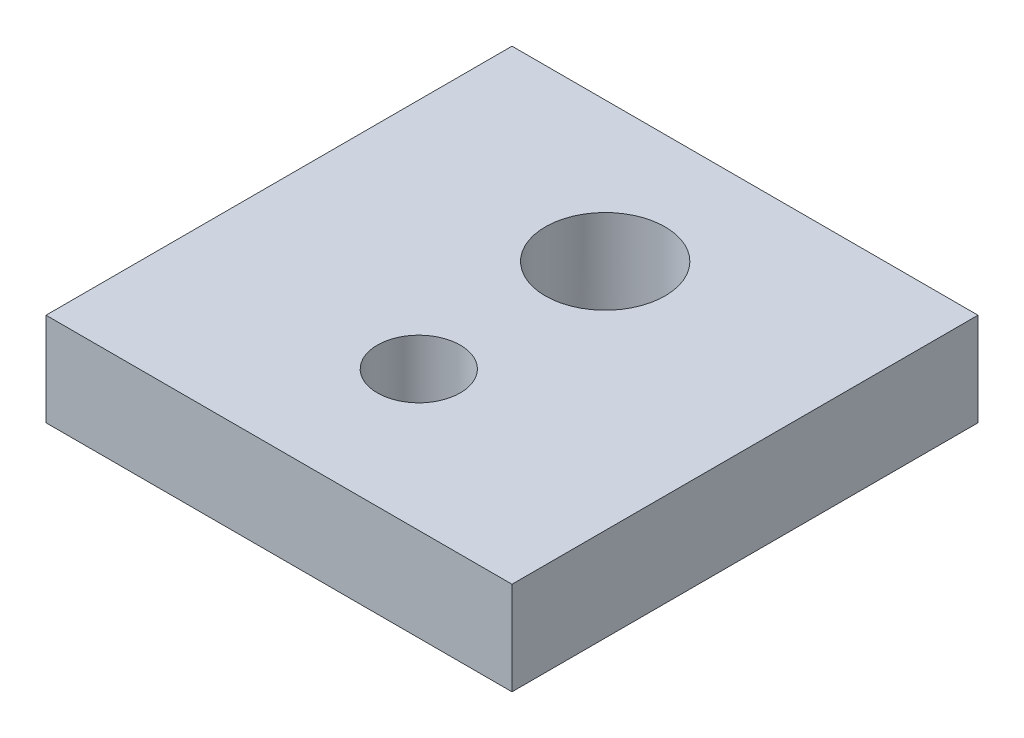
ISO-10303-21;
HEADER;
FILE_DESCRIPTION(('STEP AP214'),'2;1');
FILE_NAME('part.step','',(''),(''),'','','');
FILE_SCHEMA(('AUTOMOTIVE_DESIGN { 1 0 10303 214 1 1 1 1 }'));
ENDSEC;
DATA;
#1=APPLICATION_CONTEXT('core data for automotive mechanical design processes');
#2=APPLICATION_PROTOCOL_DEFINITION('international standard','automotive_design',2000,#1);
#3=PRODUCT_CONTEXT('',#1,'mechanical');
#4=PRODUCT('Part','Part','',(#3));
#5=PRODUCT_RELATED_PRODUCT_CATEGORY('part','',(#4));
#6=PRODUCT_DEFINITION_FORMATION('','',#4);
#7=PRODUCT_DEFINITION_CONTEXT('part definition',#1,'design');
#8=PRODUCT_DEFINITION('design','',#6,#7);
#9=PRODUCT_DEFINITION_SHAPE('','',#8);
#10=(LENGTH_UNIT() NAMED_UNIT(*) SI_UNIT(.MILLI.,.METRE.));
#11=(NAMED_UNIT(*) PLANE_ANGLE_UNIT() SI_UNIT($,.RADIAN.));
#12=(NAMED_UNIT(*) SI_UNIT($,.STERADIAN.) SOLID_ANGLE_UNIT());
#13=UNCERTAINTY_MEASURE_WITH_UNIT(LENGTH_MEASURE(1.E-05),#10,'distance_accuracy_value','');
#14=(GEOMETRIC_REPRESENTATION_CONTEXT(3) GLOBAL_UNCERTAINTY_ASSIGNED_CONTEXT((#13)) GLOBAL_UNIT_ASSIGNED_CONTEXT((#10,
#11,#12)) REPRESENTATION_CONTEXT('',''));
#15=CARTESIAN_POINT('',(0.,0.,0.));
#16=DIRECTION('',(0.,0.,1.));
#17=DIRECTION('',(1.,0.,0.));
#18=AXIS2_PLACEMENT_3D('',#15,#16,#17);
#19=CARTESIAN_POINT('',(6.35,2.54,6.35));
#20=DIRECTION('',(-1.,0.,0.));
#21=DIRECTION('',(0.,0.,1.));
#22=AXIS2_PLACEMENT_3D('',#19,#20,#21);
#23=PLANE('',#22);
#24=DIRECTION('',(0.,0.,-1.));
#25=VECTOR('',#24,1.);
#26=CARTESIAN_POINT('',(6.35,0.,6.35));
#27=LINE('',#26,#25);
#28=CARTESIAN_POINT('',(6.35,0.,6.35));
#29=VERTEX_POINT('',#28);
#30=CARTESIAN_POINT('',(6.35,0.,-6.35));
#31=VERTEX_POINT('',#30);
#32=EDGE_CURVE('E107',#29,#31,#27,.T.);
#33=ORIENTED_EDGE('',*,*,#32,.T.);
#34=DIRECTION('',(0.,-1.,0.));
#35=VECTOR('',#34,1.);
#36=CARTESIAN_POINT('',(6.35,2.54,-6.35));
#37=LINE('',#36,#35);
#38=CARTESIAN_POINT('',(6.35,2.54,-6.35));
#39=VERTEX_POINT('',#38);
#40=EDGE_CURVE('E11',#39,#31,#37,.T.);
#41=ORIENTED_EDGE('',*,*,#40,.F.);
#42=DIRECTION('',(0.,0.,-1.));
#43=VECTOR('',#42,1.);
#44=CARTESIAN_POINT('',(6.35,2.54,6.35));
#45=LINE('',#44,#43);
#46=CARTESIAN_POINT('',(6.35,2.54,6.35));
#47=VERTEX_POINT('',#46);
#48=EDGE_CURVE('E91',#47,#39,#45,.T.);
#49=ORIENTED_EDGE('',*,*,#48,.F.);
#50=DIRECTION('',(0.,-1.,0.));
#51=VECTOR('',#50,1.);
#52=CARTESIAN_POINT('',(6.35,2.54,6.35));
#53=LINE('',#52,#51);
#54=EDGE_CURVE('E103',#47,#29,#53,.T.);
#55=ORIENTED_EDGE('',*,*,#54,.T.);
#56=EDGE_LOOP('',(#33,#41,#49,#55));
#57=FACE_BOUND('',#56,.T.);
#58=ADVANCED_FACE('F39',(#57),#23,.F.);
#59=CARTESIAN_POINT('',(-6.35,2.54,-6.35));
#60=DIRECTION('',(0.,0.,1.));
#61=DIRECTION('',(1.,0.,0.));
#62=AXIS2_PLACEMENT_3D('',#59,#60,#61);
#63=PLANE('',#62);
#64=DIRECTION('',(-1.,0.,0.));
#65=VECTOR('',#64,1.);
#66=CARTESIAN_POINT('',(-6.35,0.,-6.35));
#67=LINE('',#66,#65);
#68=CARTESIAN_POINT('',(-6.35,0.,-6.35));
#69=VERTEX_POINT('',#68);
#70=EDGE_CURVE('E96',#31,#69,#67,.T.);
#71=ORIENTED_EDGE('',*,*,#70,.T.);
#72=DIRECTION('',(0.,-1.,0.));
#73=VECTOR('',#72,1.);
#74=CARTESIAN_POINT('',(-6.35,2.54,-6.35));
#75=LINE('',#74,#73);
#76=CARTESIAN_POINT('',(-6.35,2.54,-6.35));
#77=VERTEX_POINT('',#76);
#78=EDGE_CURVE('E48',#77,#69,#75,.T.);
#79=ORIENTED_EDGE('',*,*,#78,.F.);
#80=DIRECTION('',(-1.,0.,0.));
#81=VECTOR('',#80,1.);
#82=CARTESIAN_POINT('',(-6.35,2.54,-6.35));
#83=LINE('',#82,#81);
#84=EDGE_CURVE('E86',#39,#77,#83,.T.);
#85=ORIENTED_EDGE('',*,*,#84,.F.);
#86=ORIENTED_EDGE('',*,*,#40,.T.);
#87=EDGE_LOOP('',(#71,#79,#85,#86));
#88=FACE_BOUND('',#87,.T.);
#89=ADVANCED_FACE('F95',(#88),#63,.F.);
#90=CARTESIAN_POINT('',(-6.35,2.54,6.35));
#91=DIRECTION('',(1.,0.,0.));
#92=DIRECTION('',(0.,0.,-1.));
#93=AXIS2_PLACEMENT_3D('',#90,#91,#92);
#94=PLANE('',#93);
#95=DIRECTION('',(0.,0.,1.));
#96=VECTOR('',#95,1.);
#97=CARTESIAN_POINT('',(-6.35,0.,6.35));
#98=LINE('',#97,#96);
#99=CARTESIAN_POINT('',(-6.35,0.,6.35));
#100=VERTEX_POINT('',#99);
#101=EDGE_CURVE('E73',#69,#100,#98,.T.);
#102=ORIENTED_EDGE('',*,*,#101,.T.);
#103=DIRECTION('',(0.,-1.,0.));
#104=VECTOR('',#103,1.);
#105=CARTESIAN_POINT('',(-6.35,2.54,6.35));
#106=LINE('',#105,#104);
#107=CARTESIAN_POINT('',(-6.35,2.54,6.35));
#108=VERTEX_POINT('',#107);
#109=EDGE_CURVE('E98',#108,#100,#106,.T.);
#110=ORIENTED_EDGE('',*,*,#109,.F.);
#111=DIRECTION('',(0.,0.,1.));
#112=VECTOR('',#111,1.);
#113=CARTESIAN_POINT('',(-6.35,2.54,6.35));
#114=LINE('',#113,#112);
#115=EDGE_CURVE('E89',#77,#108,#114,.T.);
#116=ORIENTED_EDGE('',*,*,#115,.F.);
#117=ORIENTED_EDGE('',*,*,#78,.T.);
#118=EDGE_LOOP('',(#102,#110,#116,#117));
#119=FACE_BOUND('',#118,.T.);
#120=ADVANCED_FACE('F99',(#119),#94,.F.);
#121=CARTESIAN_POINT('',(-6.35,2.54,6.35));
#122=DIRECTION('',(0.,0.,-1.));
#123=DIRECTION('',(-1.,0.,0.));
#124=AXIS2_PLACEMENT_3D('',#121,#122,#123);
#125=PLANE('',#124);
#126=DIRECTION('',(1.,0.,0.));
#127=VECTOR('',#126,1.);
#128=CARTESIAN_POINT('',(-6.35,0.,6.35));
#129=LINE('',#128,#127);
#130=EDGE_CURVE('E79',#100,#29,#129,.T.);
#131=ORIENTED_EDGE('',*,*,#130,.T.);
#132=ORIENTED_EDGE('',*,*,#54,.F.);
#133=DIRECTION('',(1.,0.,0.));
#134=VECTOR('',#133,1.);
#135=CARTESIAN_POINT('',(-6.35,2.54,6.35));
#136=LINE('',#135,#134);
#137=EDGE_CURVE('E56',#108,#47,#136,.T.);
#138=ORIENTED_EDGE('',*,*,#137,.F.);
#139=ORIENTED_EDGE('',*,*,#109,.T.);
#140=EDGE_LOOP('',(#131,#132,#138,#139));
#141=FACE_BOUND('',#140,.T.);
#142=ADVANCED_FACE('F121',(#141),#125,.F.);
#143=CARTESIAN_POINT('',(0.,2.54,0.));
#144=DIRECTION('',(0.,-1.,0.));
#145=DIRECTION('',(0.,0.,-1.));
#146=AXIS2_PLACEMENT_3D('',#143,#144,#145);
#147=PLANE('',#146);
#148=CARTESIAN_POINT('',(0.,2.54,2.54));
#149=DIRECTION('',(0.,1.,0.));
#150=DIRECTION('',(0.,0.,1.));
#151=AXIS2_PLACEMENT_3D('',#148,#149,#150);
#152=CIRCLE('',#151,1.1303);
#153=CARTESIAN_POINT('',(0.,2.54,3.6703));
#154=VERTEX_POINT('',#153);
#155=EDGE_CURVE('E139',#154,#154,#152,.T.);
#156=ORIENTED_EDGE('',*,*,#155,.F.);
#157=EDGE_LOOP('',(#156));
#158=FACE_BOUND('',#157,.T.);
#159=CARTESIAN_POINT('',(0.,2.54,-2.54));
#160=DIRECTION('',(0.,1.,0.));
#161=DIRECTION('',(0.,0.,1.));
#162=AXIS2_PLACEMENT_3D('',#159,#160,#161);
#163=CIRCLE('',#162,1.63194999999999);
#164=CARTESIAN_POINT('',(0.,2.54,-0.908050000000013));
#165=VERTEX_POINT('',#164);
#166=EDGE_CURVE('E131',#165,#165,#163,.T.);
#167=ORIENTED_EDGE('',*,*,#166,.F.);
#168=EDGE_LOOP('',(#167));
#169=FACE_BOUND('',#168,.T.);
#170=ORIENTED_EDGE('',*,*,#48,.T.);
#171=ORIENTED_EDGE('',*,*,#84,.T.);
#172=ORIENTED_EDGE('',*,*,#115,.T.);
#173=ORIENTED_EDGE('',*,*,#137,.T.);
#174=EDGE_LOOP('',(#170,#171,#172,#173));
#175=FACE_BOUND('',#174,.T.);
#176=ADVANCED_FACE('F87',(#158,#169,#175),#147,.F.);
#177=CARTESIAN_POINT('',(0.,0.,0.));
#178=DIRECTION('',(0.,-1.,0.));
#179=DIRECTION('',(0.,0.,-1.));
#180=AXIS2_PLACEMENT_3D('',#177,#178,#179);
#181=PLANE('',#180);
#182=CARTESIAN_POINT('',(0.,0.,2.54));
#183=DIRECTION('',(0.,-1.,0.));
#184=DIRECTION('',(0.,0.,-1.));
#185=AXIS2_PLACEMENT_3D('',#182,#183,#184);
#186=CIRCLE('',#185,1.1303);
#187=CARTESIAN_POINT('',(0.,0.,1.4097));
#188=VERTEX_POINT('',#187);
#189=EDGE_CURVE('E135',#188,#188,#186,.F.);
#190=ORIENTED_EDGE('',*,*,#189,.T.);
#191=EDGE_LOOP('',(#190));
#192=FACE_BOUND('',#191,.T.);
#193=CARTESIAN_POINT('',(0.,0.,-2.54));
#194=DIRECTION('',(0.,-1.,0.));
#195=DIRECTION('',(0.,0.,-1.));
#196=AXIS2_PLACEMENT_3D('',#193,#194,#195);
#197=CIRCLE('',#196,1.63194999999999);
#198=CARTESIAN_POINT('',(0.,0.,-4.17195));
#199=VERTEX_POINT('',#198);
#200=EDGE_CURVE('E111',#199,#199,#197,.F.);
#201=ORIENTED_EDGE('',*,*,#200,.T.);
#202=EDGE_LOOP('',(#201));
#203=FACE_BOUND('',#202,.T.);
#204=ORIENTED_EDGE('',*,*,#32,.F.);
#205=ORIENTED_EDGE('',*,*,#130,.F.);
#206=ORIENTED_EDGE('',*,*,#101,.F.);
#207=ORIENTED_EDGE('',*,*,#70,.F.);
#208=EDGE_LOOP('',(#204,#205,#206,#207));
#209=FACE_BOUND('',#208,.T.);
#210=ADVANCED_FACE('F124',(#192,#203,#209),#181,.T.);
#211=CARTESIAN_POINT('',(0.,2.54,-2.54));
#212=DIRECTION('',(0.,1.,0.));
#213=DIRECTION('',(0.,0.,1.));
#214=AXIS2_PLACEMENT_3D('',#211,#212,#213);
#215=CYLINDRICAL_SURFACE('',#214,1.63194999999999);
#216=ORIENTED_EDGE('',*,*,#200,.F.);
#217=EDGE_LOOP('',(#216));
#218=FACE_BOUND('',#217,.T.);
#219=ORIENTED_EDGE('',*,*,#166,.T.);
#220=EDGE_LOOP('',(#219));
#221=FACE_BOUND('',#220,.T.);
#222=ADVANCED_FACE('F151',(#218,#221),#215,.F.);
#223=CARTESIAN_POINT('',(0.,2.54,2.54));
#224=DIRECTION('',(0.,1.,0.));
#225=DIRECTION('',(0.,0.,1.));
#226=AXIS2_PLACEMENT_3D('',#223,#224,#225);
#227=CYLINDRICAL_SURFACE('',#226,1.1303);
#228=ORIENTED_EDGE('',*,*,#189,.F.);
#229=EDGE_LOOP('',(#228));
#230=FACE_BOUND('',#229,.T.);
#231=ORIENTED_EDGE('',*,*,#155,.T.);
#232=EDGE_LOOP('',(#231));
#233=FACE_BOUND('',#232,.T.);
#234=ADVANCED_FACE('F144',(#230,#233),#227,.F.);
#235=CLOSED_SHELL('',(#58,#89,#120,#142,#176,#210,#222,#234));
#236=MANIFOLD_SOLID_BREP('B2',#235);
#237=ADVANCED_BREP_SHAPE_REPRESENTATION('',(#18,#236),#14);
#238=SHAPE_DEFINITION_REPRESENTATION(#9,#237);
ENDSEC;
END-ISO-10303-21;
